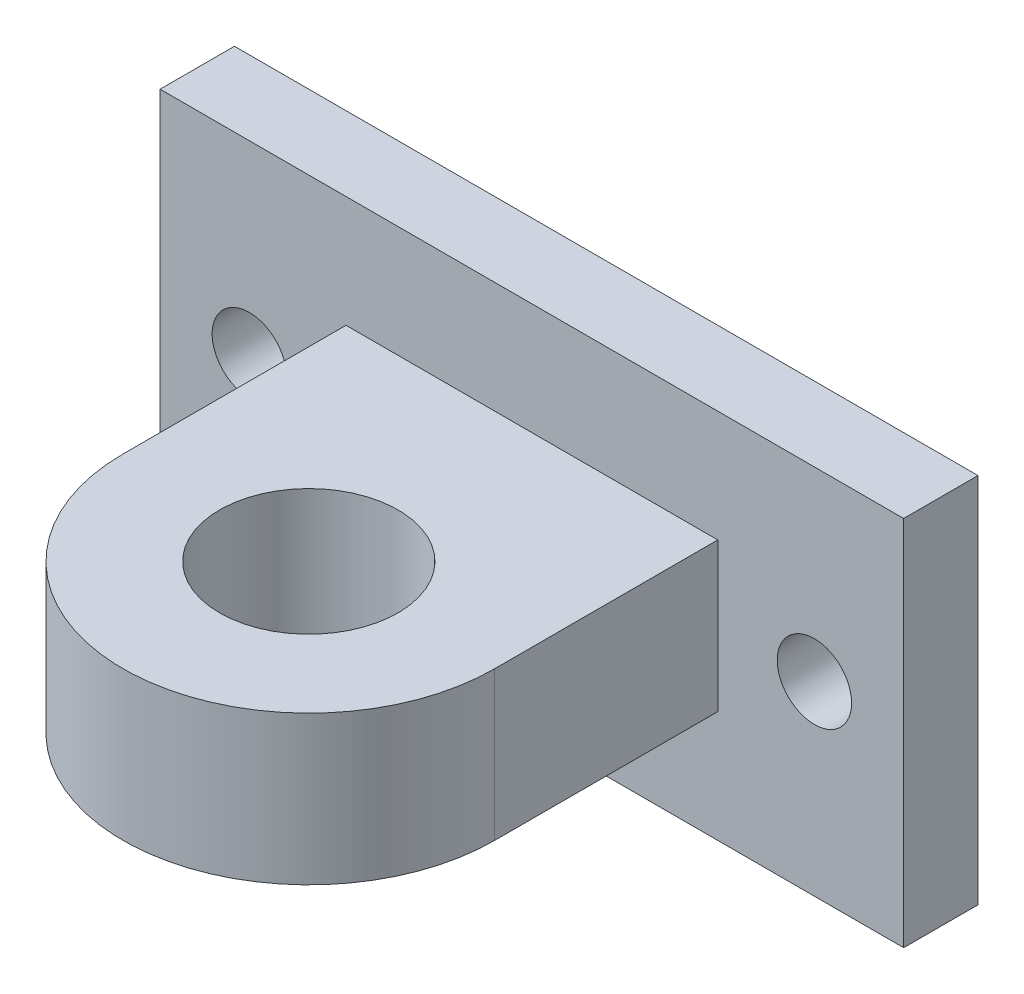
ISO-10303-21;
HEADER;
FILE_DESCRIPTION(('STEP AP214'),'2;1');
FILE_NAME('part.step','',(''),(''),'','','');
FILE_SCHEMA(('AUTOMOTIVE_DESIGN { 1 0 10303 214 1 1 1 1 }'));
ENDSEC;
DATA;
#1=APPLICATION_CONTEXT('core data for automotive mechanical design processes');
#2=APPLICATION_PROTOCOL_DEFINITION('international standard','automotive_design',2000,#1);
#3=PRODUCT_CONTEXT('',#1,'mechanical');
#4=PRODUCT('Part','Part','',(#3));
#5=PRODUCT_RELATED_PRODUCT_CATEGORY('part','',(#4));
#6=PRODUCT_DEFINITION_FORMATION('','',#4);
#7=PRODUCT_DEFINITION_CONTEXT('part definition',#1,'design');
#8=PRODUCT_DEFINITION('design','',#6,#7);
#9=PRODUCT_DEFINITION_SHAPE('','',#8);
#10=(LENGTH_UNIT() NAMED_UNIT(*) SI_UNIT(.MILLI.,.METRE.));
#11=(NAMED_UNIT(*) PLANE_ANGLE_UNIT() SI_UNIT($,.RADIAN.));
#12=(NAMED_UNIT(*) SI_UNIT($,.STERADIAN.) SOLID_ANGLE_UNIT());
#13=UNCERTAINTY_MEASURE_WITH_UNIT(LENGTH_MEASURE(1.E-05),#10,'distance_accuracy_value','');
#14=(GEOMETRIC_REPRESENTATION_CONTEXT(3) GLOBAL_UNCERTAINTY_ASSIGNED_CONTEXT((#13)) GLOBAL_UNIT_ASSIGNED_CONTEXT((#10,
#11,#12)) REPRESENTATION_CONTEXT('',''));
#15=CARTESIAN_POINT('',(0.,0.,0.));
#16=DIRECTION('',(0.,0.,1.));
#17=DIRECTION('',(1.,0.,0.));
#18=AXIS2_PLACEMENT_3D('',#15,#16,#17);
#19=CARTESIAN_POINT('',(-50.,25.,10.));
#20=DIRECTION('',(1.,0.,0.));
#21=DIRECTION('',(0.,0.,-1.));
#22=AXIS2_PLACEMENT_3D('',#19,#20,#21);
#23=PLANE('',#22);
#24=DIRECTION('',(0.,-1.,0.));
#25=VECTOR('',#24,1.);
#26=CARTESIAN_POINT('',(-50.,25.,0.));
#27=LINE('',#26,#25);
#28=CARTESIAN_POINT('',(-50.,25.,0.));
#29=VERTEX_POINT('',#28);
#30=CARTESIAN_POINT('',(-50.,-25.,0.));
#31=VERTEX_POINT('',#30);
#32=EDGE_CURVE('E181',#29,#31,#27,.T.);
#33=ORIENTED_EDGE('',*,*,#32,.T.);
#34=DIRECTION('',(0.,0.,-1.));
#35=VECTOR('',#34,1.);
#36=CARTESIAN_POINT('',(-50.,-25.,10.));
#37=LINE('',#36,#35);
#38=CARTESIAN_POINT('',(-50.,-25.,10.));
#39=VERTEX_POINT('',#38);
#40=EDGE_CURVE('E11',#39,#31,#37,.T.);
#41=ORIENTED_EDGE('',*,*,#40,.F.);
#42=DIRECTION('',(0.,-1.,0.));
#43=VECTOR('',#42,1.);
#44=CARTESIAN_POINT('',(-50.,25.,10.));
#45=LINE('',#44,#43);
#46=CARTESIAN_POINT('',(-50.,25.,10.));
#47=VERTEX_POINT('',#46);
#48=EDGE_CURVE('E182',#47,#39,#45,.T.);
#49=ORIENTED_EDGE('',*,*,#48,.F.);
#50=DIRECTION('',(0.,0.,-1.));
#51=VECTOR('',#50,1.);
#52=CARTESIAN_POINT('',(-50.,25.,10.));
#53=LINE('',#52,#51);
#54=EDGE_CURVE('E192',#47,#29,#53,.T.);
#55=ORIENTED_EDGE('',*,*,#54,.T.);
#56=EDGE_LOOP('',(#33,#41,#49,#55));
#57=FACE_BOUND('',#56,.T.);
#58=ADVANCED_FACE('F51',(#57),#23,.F.);
#59=CARTESIAN_POINT('',(-50.,-25.,10.));
#60=DIRECTION('',(0.,1.,0.));
#61=DIRECTION('',(0.,0.,1.));
#62=AXIS2_PLACEMENT_3D('',#59,#60,#61);
#63=PLANE('',#62);
#64=DIRECTION('',(1.,0.,0.));
#65=VECTOR('',#64,1.);
#66=CARTESIAN_POINT('',(-50.,-25.,0.));
#67=LINE('',#66,#65);
#68=CARTESIAN_POINT('',(50.,-25.,0.));
#69=VERTEX_POINT('',#68);
#70=EDGE_CURVE('E196',#31,#69,#67,.T.);
#71=ORIENTED_EDGE('',*,*,#70,.T.);
#72=DIRECTION('',(0.,0.,-1.));
#73=VECTOR('',#72,1.);
#74=CARTESIAN_POINT('',(50.,-25.,10.));
#75=LINE('',#74,#73);
#76=CARTESIAN_POINT('',(50.,-25.,10.));
#77=VERTEX_POINT('',#76);
#78=EDGE_CURVE('E61',#77,#69,#75,.T.);
#79=ORIENTED_EDGE('',*,*,#78,.F.);
#80=DIRECTION('',(1.,0.,0.));
#81=VECTOR('',#80,1.);
#82=CARTESIAN_POINT('',(-50.,-25.,10.));
#83=LINE('',#82,#81);
#84=EDGE_CURVE('E105',#39,#77,#83,.T.);
#85=ORIENTED_EDGE('',*,*,#84,.F.);
#86=ORIENTED_EDGE('',*,*,#40,.T.);
#87=EDGE_LOOP('',(#71,#79,#85,#86));
#88=FACE_BOUND('',#87,.T.);
#89=ADVANCED_FACE('F231',(#88),#63,.F.);
#90=CARTESIAN_POINT('',(50.,-25.,10.));
#91=DIRECTION('',(-1.,0.,0.));
#92=DIRECTION('',(0.,0.,1.));
#93=AXIS2_PLACEMENT_3D('',#90,#91,#92);
#94=PLANE('',#93);
#95=DIRECTION('',(0.,1.,0.));
#96=VECTOR('',#95,1.);
#97=CARTESIAN_POINT('',(50.,-25.,0.));
#98=LINE('',#97,#96);
#99=CARTESIAN_POINT('',(50.,25.,0.));
#100=VERTEX_POINT('',#99);
#101=EDGE_CURVE('E199',#69,#100,#98,.T.);
#102=ORIENTED_EDGE('',*,*,#101,.T.);
#103=DIRECTION('',(0.,0.,-1.));
#104=VECTOR('',#103,1.);
#105=CARTESIAN_POINT('',(50.,25.,10.));
#106=LINE('',#105,#104);
#107=CARTESIAN_POINT('',(50.,25.,10.));
#108=VERTEX_POINT('',#107);
#109=EDGE_CURVE('E206',#108,#100,#106,.T.);
#110=ORIENTED_EDGE('',*,*,#109,.F.);
#111=DIRECTION('',(0.,1.,0.));
#112=VECTOR('',#111,1.);
#113=CARTESIAN_POINT('',(50.,-25.,10.));
#114=LINE('',#113,#112);
#115=EDGE_CURVE('E187',#77,#108,#114,.T.);
#116=ORIENTED_EDGE('',*,*,#115,.F.);
#117=ORIENTED_EDGE('',*,*,#78,.T.);
#118=EDGE_LOOP('',(#102,#110,#116,#117));
#119=FACE_BOUND('',#118,.T.);
#120=ADVANCED_FACE('F214',(#119),#94,.F.);
#121=CARTESIAN_POINT('',(50.,25.,10.));
#122=DIRECTION('',(0.,-1.,0.));
#123=DIRECTION('',(0.,0.,-1.));
#124=AXIS2_PLACEMENT_3D('',#121,#122,#123);
#125=PLANE('',#124);
#126=DIRECTION('',(-1.,0.,0.));
#127=VECTOR('',#126,1.);
#128=CARTESIAN_POINT('',(50.,25.,0.));
#129=LINE('',#128,#127);
#130=EDGE_CURVE('E98',#100,#29,#129,.T.);
#131=ORIENTED_EDGE('',*,*,#130,.T.);
#132=ORIENTED_EDGE('',*,*,#54,.F.);
#133=DIRECTION('',(-1.,0.,0.));
#134=VECTOR('',#133,1.);
#135=CARTESIAN_POINT('',(50.,25.,10.));
#136=LINE('',#135,#134);
#137=EDGE_CURVE('E77',#108,#47,#136,.T.);
#138=ORIENTED_EDGE('',*,*,#137,.F.);
#139=ORIENTED_EDGE('',*,*,#109,.T.);
#140=EDGE_LOOP('',(#131,#132,#138,#139));
#141=FACE_BOUND('',#140,.T.);
#142=ADVANCED_FACE('F222',(#141),#125,.F.);
#143=CARTESIAN_POINT('',(0.,0.,10.));
#144=DIRECTION('',(0.,0.,1.));
#145=DIRECTION('',(1.,0.,0.));
#146=AXIS2_PLACEMENT_3D('',#143,#144,#145);
#147=PLANE('',#146);
#148=CARTESIAN_POINT('',(-38.,0.,10.));
#149=DIRECTION('',(0.,0.,1.));
#150=DIRECTION('',(1.,0.,0.));
#151=AXIS2_PLACEMENT_3D('',#148,#149,#150);
#152=CIRCLE('',#151,5.);
#153=CARTESIAN_POINT('',(-33.,0.,10.));
#154=VERTEX_POINT('',#153);
#155=EDGE_CURVE('E274',#154,#154,#152,.F.);
#156=ORIENTED_EDGE('',*,*,#155,.T.);
#157=EDGE_LOOP('',(#156));
#158=FACE_BOUND('',#157,.T.);
#159=CARTESIAN_POINT('',(38.,0.,10.));
#160=DIRECTION('',(0.,0.,1.));
#161=DIRECTION('',(1.,0.,0.));
#162=AXIS2_PLACEMENT_3D('',#159,#160,#161);
#163=CIRCLE('',#162,5.);
#164=CARTESIAN_POINT('',(43.,0.,10.));
#165=VERTEX_POINT('',#164);
#166=EDGE_CURVE('E280',#165,#165,#163,.F.);
#167=ORIENTED_EDGE('',*,*,#166,.T.);
#168=EDGE_LOOP('',(#167));
#169=FACE_BOUND('',#168,.T.);
#170=DIRECTION('',(-1.,0.,0.));
#171=VECTOR('',#170,1.);
#172=CARTESIAN_POINT('',(0.,10.,10.));
#173=LINE('',#172,#171);
#174=CARTESIAN_POINT('',(25.,10.,10.));
#175=VERTEX_POINT('',#174);
#176=CARTESIAN_POINT('',(-25.,10.,10.));
#177=VERTEX_POINT('',#176);
#178=EDGE_CURVE('E134',#175,#177,#173,.T.);
#179=ORIENTED_EDGE('',*,*,#178,.F.);
#180=DIRECTION('',(0.,-1.,0.));
#181=VECTOR('',#180,1.);
#182=CARTESIAN_POINT('',(25.,0.,10.));
#183=LINE('',#182,#181);
#184=CARTESIAN_POINT('',(25.,-10.,10.));
#185=VERTEX_POINT('',#184);
#186=EDGE_CURVE('E174',#175,#185,#183,.T.);
#187=ORIENTED_EDGE('',*,*,#186,.T.);
#188=DIRECTION('',(-1.,0.,0.));
#189=VECTOR('',#188,1.);
#190=CARTESIAN_POINT('',(0.,-10.,10.));
#191=LINE('',#190,#189);
#192=CARTESIAN_POINT('',(-25.,-10.,10.));
#193=VERTEX_POINT('',#192);
#194=EDGE_CURVE('E145',#185,#193,#191,.T.);
#195=ORIENTED_EDGE('',*,*,#194,.T.);
#196=DIRECTION('',(0.,1.,0.));
#197=VECTOR('',#196,1.);
#198=CARTESIAN_POINT('',(-25.,0.,10.));
#199=LINE('',#198,#197);
#200=EDGE_CURVE('E178',#193,#177,#199,.T.);
#201=ORIENTED_EDGE('',*,*,#200,.T.);
#202=EDGE_LOOP('',(#179,#187,#195,#201));
#203=FACE_BOUND('',#202,.T.);
#204=ORIENTED_EDGE('',*,*,#48,.T.);
#205=ORIENTED_EDGE('',*,*,#84,.T.);
#206=ORIENTED_EDGE('',*,*,#115,.T.);
#207=ORIENTED_EDGE('',*,*,#137,.T.);
#208=EDGE_LOOP('',(#204,#205,#206,#207));
#209=FACE_BOUND('',#208,.T.);
#210=ADVANCED_FACE('F224',(#158,#169,#203,#209),#147,.T.);
#211=CARTESIAN_POINT('',(0.,0.,0.));
#212=DIRECTION('',(0.,0.,1.));
#213=DIRECTION('',(1.,0.,0.));
#214=AXIS2_PLACEMENT_3D('',#211,#212,#213);
#215=PLANE('',#214);
#216=CARTESIAN_POINT('',(-38.,0.,0.));
#217=DIRECTION('',(0.,0.,1.));
#218=DIRECTION('',(1.,0.,0.));
#219=AXIS2_PLACEMENT_3D('',#216,#217,#218);
#220=CIRCLE('',#219,5.);
#221=CARTESIAN_POINT('',(-33.,0.,0.));
#222=VERTEX_POINT('',#221);
#223=EDGE_CURVE('E277',#222,#222,#220,.T.);
#224=ORIENTED_EDGE('',*,*,#223,.T.);
#225=EDGE_LOOP('',(#224));
#226=FACE_BOUND('',#225,.T.);
#227=CARTESIAN_POINT('',(38.,0.,0.));
#228=DIRECTION('',(0.,0.,1.));
#229=DIRECTION('',(1.,0.,0.));
#230=AXIS2_PLACEMENT_3D('',#227,#228,#229);
#231=CIRCLE('',#230,5.);
#232=CARTESIAN_POINT('',(43.,0.,0.));
#233=VERTEX_POINT('',#232);
#234=EDGE_CURVE('E281',#233,#233,#231,.T.);
#235=ORIENTED_EDGE('',*,*,#234,.T.);
#236=EDGE_LOOP('',(#235));
#237=FACE_BOUND('',#236,.T.);
#238=ORIENTED_EDGE('',*,*,#32,.F.);
#239=ORIENTED_EDGE('',*,*,#130,.F.);
#240=ORIENTED_EDGE('',*,*,#101,.F.);
#241=ORIENTED_EDGE('',*,*,#70,.F.);
#242=EDGE_LOOP('',(#238,#239,#240,#241));
#243=FACE_BOUND('',#242,.T.);
#244=ADVANCED_FACE('F218',(#226,#237,#243),#215,.F.);
#245=CARTESIAN_POINT('',(-25.,10.,0.));
#246=DIRECTION('',(1.,0.,0.));
#247=DIRECTION('',(0.,0.,-1.));
#248=AXIS2_PLACEMENT_3D('',#245,#246,#247);
#249=PLANE('',#248);
#250=ORIENTED_EDGE('',*,*,#200,.F.);
#251=DIRECTION('',(0.,0.,1.));
#252=VECTOR('',#251,1.);
#253=CARTESIAN_POINT('',(-25.,-10.,0.));
#254=LINE('',#253,#252);
#255=CARTESIAN_POINT('',(-25.,-10.,40.));
#256=VERTEX_POINT('',#255);
#257=EDGE_CURVE('E68',#193,#256,#254,.T.);
#258=ORIENTED_EDGE('',*,*,#257,.T.);
#259=DIRECTION('',(0.,-1.,0.));
#260=VECTOR('',#259,1.);
#261=CARTESIAN_POINT('',(-25.,10.,40.));
#262=LINE('',#261,#260);
#263=CARTESIAN_POINT('',(-25.,10.,40.));
#264=VERTEX_POINT('',#263);
#265=EDGE_CURVE('E141',#264,#256,#262,.T.);
#266=ORIENTED_EDGE('',*,*,#265,.F.);
#267=DIRECTION('',(0.,0.,1.));
#268=VECTOR('',#267,1.);
#269=CARTESIAN_POINT('',(-25.,10.,0.));
#270=LINE('',#269,#268);
#271=EDGE_CURVE('E126',#177,#264,#270,.T.);
#272=ORIENTED_EDGE('',*,*,#271,.F.);
#273=EDGE_LOOP('',(#250,#258,#266,#272));
#274=FACE_BOUND('',#273,.T.);
#275=ADVANCED_FACE('F142',(#274),#249,.F.);
#276=CARTESIAN_POINT('',(0.,10.,40.));
#277=DIRECTION('',(0.,-1.,0.));
#278=DIRECTION('',(0.,0.,-1.));
#279=AXIS2_PLACEMENT_3D('',#276,#277,#278);
#280=CYLINDRICAL_SURFACE('',#279,25.);
#281=CARTESIAN_POINT('',(0.,-10.,40.));
#282=DIRECTION('',(0.,1.,0.));
#283=DIRECTION('',(0.,0.,1.));
#284=AXIS2_PLACEMENT_3D('',#281,#282,#283);
#285=CIRCLE('',#284,25.);
#286=CARTESIAN_POINT('',(25.,-10.,40.));
#287=VERTEX_POINT('',#286);
#288=EDGE_CURVE('E161',#256,#287,#285,.T.);
#289=ORIENTED_EDGE('',*,*,#288,.T.);
#290=DIRECTION('',(0.,-1.,0.));
#291=VECTOR('',#290,1.);
#292=CARTESIAN_POINT('',(25.,10.,40.));
#293=LINE('',#292,#291);
#294=CARTESIAN_POINT('',(25.,10.,40.));
#295=VERTEX_POINT('',#294);
#296=EDGE_CURVE('E146',#295,#287,#293,.T.);
#297=ORIENTED_EDGE('',*,*,#296,.F.);
#298=CARTESIAN_POINT('',(0.,10.,40.));
#299=DIRECTION('',(0.,1.,0.));
#300=DIRECTION('',(0.,0.,1.));
#301=AXIS2_PLACEMENT_3D('',#298,#299,#300);
#302=CIRCLE('',#301,25.);
#303=EDGE_CURVE('E131',#264,#295,#302,.T.);
#304=ORIENTED_EDGE('',*,*,#303,.F.);
#305=ORIENTED_EDGE('',*,*,#265,.T.);
#306=EDGE_LOOP('',(#289,#297,#304,#305));
#307=FACE_BOUND('',#306,.T.);
#308=ADVANCED_FACE('F148',(#307),#280,.T.);
#309=CARTESIAN_POINT('',(25.,10.,40.));
#310=DIRECTION('',(-1.,0.,0.));
#311=DIRECTION('',(0.,0.,1.));
#312=AXIS2_PLACEMENT_3D('',#309,#310,#311);
#313=PLANE('',#312);
#314=ORIENTED_EDGE('',*,*,#186,.F.);
#315=DIRECTION('',(0.,0.,-1.));
#316=VECTOR('',#315,1.);
#317=CARTESIAN_POINT('',(25.,10.,40.));
#318=LINE('',#317,#316);
#319=EDGE_CURVE('E152',#295,#175,#318,.T.);
#320=ORIENTED_EDGE('',*,*,#319,.F.);
#321=ORIENTED_EDGE('',*,*,#296,.T.);
#322=DIRECTION('',(0.,0.,-1.));
#323=VECTOR('',#322,1.);
#324=CARTESIAN_POINT('',(25.,-10.,40.));
#325=LINE('',#324,#323);
#326=EDGE_CURVE('E138',#287,#185,#325,.T.);
#327=ORIENTED_EDGE('',*,*,#326,.T.);
#328=EDGE_LOOP('',(#314,#320,#321,#327));
#329=FACE_BOUND('',#328,.T.);
#330=ADVANCED_FACE('F250',(#329),#313,.F.);
#331=CARTESIAN_POINT('',(0.,10.,40.));
#332=DIRECTION('',(0.,1.,0.));
#333=DIRECTION('',(0.,0.,1.));
#334=AXIS2_PLACEMENT_3D('',#331,#332,#333);
#335=PLANE('',#334);
#336=CARTESIAN_POINT('',(0.,9.99999999999999,40.));
#337=DIRECTION('',(0.,1.,0.));
#338=DIRECTION('',(0.,0.,1.));
#339=AXIS2_PLACEMENT_3D('',#336,#337,#338);
#340=CIRCLE('',#339,12.);
#341=CARTESIAN_POINT('',(0.,9.99999999999999,52.));
#342=VERTEX_POINT('',#341);
#343=EDGE_CURVE('E162',#342,#342,#340,.T.);
#344=ORIENTED_EDGE('',*,*,#343,.F.);
#345=EDGE_LOOP('',(#344));
#346=FACE_BOUND('',#345,.T.);
#347=ORIENTED_EDGE('',*,*,#319,.T.);
#348=ORIENTED_EDGE('',*,*,#178,.T.);
#349=ORIENTED_EDGE('',*,*,#271,.T.);
#350=ORIENTED_EDGE('',*,*,#303,.T.);
#351=EDGE_LOOP('',(#347,#348,#349,#350));
#352=FACE_BOUND('',#351,.T.);
#353=ADVANCED_FACE('F129',(#346,#352),#335,.T.);
#354=CARTESIAN_POINT('',(0.,-10.,40.));
#355=DIRECTION('',(0.,1.,0.));
#356=DIRECTION('',(0.,0.,1.));
#357=AXIS2_PLACEMENT_3D('',#354,#355,#356);
#358=PLANE('',#357);
#359=CARTESIAN_POINT('',(0.,-9.99999999999999,40.));
#360=DIRECTION('',(0.,1.,0.));
#361=DIRECTION('',(0.,0.,1.));
#362=AXIS2_PLACEMENT_3D('',#359,#360,#361);
#363=CIRCLE('',#362,12.);
#364=CARTESIAN_POINT('',(0.,-9.99999999999999,52.));
#365=VERTEX_POINT('',#364);
#366=EDGE_CURVE('E55',#365,#365,#363,.T.);
#367=ORIENTED_EDGE('',*,*,#366,.T.);
#368=EDGE_LOOP('',(#367));
#369=FACE_BOUND('',#368,.T.);
#370=ORIENTED_EDGE('',*,*,#194,.F.);
#371=ORIENTED_EDGE('',*,*,#326,.F.);
#372=ORIENTED_EDGE('',*,*,#288,.F.);
#373=ORIENTED_EDGE('',*,*,#257,.F.);
#374=EDGE_LOOP('',(#370,#371,#372,#373));
#375=FACE_BOUND('',#374,.T.);
#376=ADVANCED_FACE('F256',(#369,#375),#358,.F.);
#377=CARTESIAN_POINT('',(0.,-101.,40.));
#378=DIRECTION('',(0.,1.,0.));
#379=DIRECTION('',(0.,0.,1.));
#380=AXIS2_PLACEMENT_3D('',#377,#378,#379);
#381=CYLINDRICAL_SURFACE('',#380,12.);
#382=ORIENTED_EDGE('',*,*,#343,.T.);
#383=EDGE_LOOP('',(#382));
#384=FACE_BOUND('',#383,.T.);
#385=ORIENTED_EDGE('',*,*,#366,.F.);
#386=EDGE_LOOP('',(#385));
#387=FACE_BOUND('',#386,.T.);
#388=ADVANCED_FACE('F257',(#384,#387),#381,.F.);
#389=CARTESIAN_POINT('',(38.,0.,65.));
#390=DIRECTION('',(0.,0.,-1.));
#391=DIRECTION('',(-1.,0.,0.));
#392=AXIS2_PLACEMENT_3D('',#389,#390,#391);
#393=CYLINDRICAL_SURFACE('',#392,5.);
#394=ORIENTED_EDGE('',*,*,#166,.F.);
#395=EDGE_LOOP('',(#394));
#396=FACE_BOUND('',#395,.T.);
#397=ORIENTED_EDGE('',*,*,#234,.F.);
#398=EDGE_LOOP('',(#397));
#399=FACE_BOUND('',#398,.T.);
#400=ADVANCED_FACE('F260',(#396,#399),#393,.F.);
#401=CARTESIAN_POINT('',(-38.,0.,65.));
#402=DIRECTION('',(0.,0.,-1.));
#403=DIRECTION('',(-1.,0.,0.));
#404=AXIS2_PLACEMENT_3D('',#401,#402,#403);
#405=CYLINDRICAL_SURFACE('',#404,5.);
#406=ORIENTED_EDGE('',*,*,#155,.F.);
#407=EDGE_LOOP('',(#406));
#408=FACE_BOUND('',#407,.T.);
#409=ORIENTED_EDGE('',*,*,#223,.F.);
#410=EDGE_LOOP('',(#409));
#411=FACE_BOUND('',#410,.T.);
#412=ADVANCED_FACE('F266',(#408,#411),#405,.F.);
#413=CLOSED_SHELL('',(#58,#89,#120,#142,#210,#244,#275,#308,#330,#353,#376,#388,#400,#412));
#414=MANIFOLD_SOLID_BREP('B2',#413);
#415=ADVANCED_BREP_SHAPE_REPRESENTATION('',(#18,#414),#14);
#416=SHAPE_DEFINITION_REPRESENTATION(#9,#415);
ENDSEC;
END-ISO-10303-21;
